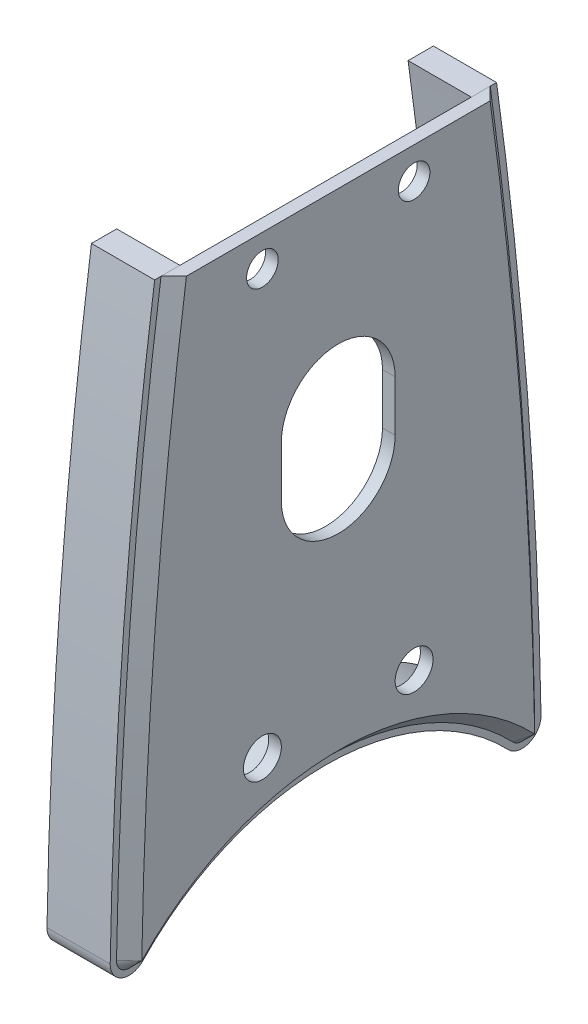
ISO-10303-21;
HEADER;
FILE_DESCRIPTION(('STEP AP214'),'2;1');
FILE_NAME('part.step','',(''),(''),'','','');
FILE_SCHEMA(('AUTOMOTIVE_DESIGN { 1 0 10303 214 1 1 1 1 }'));
ENDSEC;
DATA;
#1=APPLICATION_CONTEXT('core data for automotive mechanical design processes');
#2=APPLICATION_PROTOCOL_DEFINITION('international standard','automotive_design',2000,#1);
#3=PRODUCT_CONTEXT('',#1,'mechanical');
#4=PRODUCT('Part','Part','',(#3));
#5=PRODUCT_RELATED_PRODUCT_CATEGORY('part','',(#4));
#6=PRODUCT_DEFINITION_FORMATION('','',#4);
#7=PRODUCT_DEFINITION_CONTEXT('part definition',#1,'design');
#8=PRODUCT_DEFINITION('design','',#6,#7);
#9=PRODUCT_DEFINITION_SHAPE('','',#8);
#10=(LENGTH_UNIT() NAMED_UNIT(*) SI_UNIT(.MILLI.,.METRE.));
#11=(NAMED_UNIT(*) PLANE_ANGLE_UNIT() SI_UNIT($,.RADIAN.));
#12=(NAMED_UNIT(*) SI_UNIT($,.STERADIAN.) SOLID_ANGLE_UNIT());
#13=UNCERTAINTY_MEASURE_WITH_UNIT(LENGTH_MEASURE(1.E-05),#10,'distance_accuracy_value','');
#14=(GEOMETRIC_REPRESENTATION_CONTEXT(3) GLOBAL_UNCERTAINTY_ASSIGNED_CONTEXT((#13)) GLOBAL_UNIT_ASSIGNED_CONTEXT((#10,
#11,#12)) REPRESENTATION_CONTEXT('',''));
#15=CARTESIAN_POINT('',(0.,0.,0.));
#16=DIRECTION('',(0.,0.,1.));
#17=DIRECTION('',(1.,0.,0.));
#18=AXIS2_PLACEMENT_3D('',#15,#16,#17);
#19=CARTESIAN_POINT('',(-10.,38.5568522504319,26.8769258758952));
#20=DIRECTION('',(1.,0.,0.));
#21=DIRECTION('',(0.,0.,-1.));
#22=AXIS2_PLACEMENT_3D('',#19,#20,#21);
#23=CYLINDRICAL_SURFACE('',#22,3.00000000000001);
#24=CARTESIAN_POINT('',(0.,38.5568522504319,26.8769258758952));
#25=DIRECTION('',(-1.,0.,0.));
#26=DIRECTION('',(0.,0.,1.));
#27=AXIS2_PLACEMENT_3D('',#24,#25,#26);
#28=CIRCLE('',#27,3.00000000000001);
#29=CARTESIAN_POINT('',(0.,36.0957765748724,25.1613774157316));
#30=VERTEX_POINT('',#29);
#31=CARTESIAN_POINT('',(0.,38.6444801711164,29.8756458273939));
#32=VERTEX_POINT('',#31);
#33=EDGE_CURVE('E256',#30,#32,#28,.T.);
#34=ORIENTED_EDGE('',*,*,#33,.F.);
#35=DIRECTION('',(1.,0.,0.));
#36=VECTOR('',#35,1.);
#37=CARTESIAN_POINT('',(-10.,36.0957765748724,25.1613774157316));
#38=LINE('',#37,#36);
#39=CARTESIAN_POINT('',(-10.,36.0957765748724,25.1613774157316));
#40=VERTEX_POINT('',#39);
#41=EDGE_CURVE('E12',#40,#30,#38,.T.);
#42=ORIENTED_EDGE('',*,*,#41,.F.);
#43=CARTESIAN_POINT('',(-10.,38.5568522504319,26.8769258758952));
#44=DIRECTION('',(-1.,0.,0.));
#45=DIRECTION('',(0.,0.,1.));
#46=AXIS2_PLACEMENT_3D('',#43,#44,#45);
#47=CIRCLE('',#46,3.00000000000001);
#48=CARTESIAN_POINT('',(-10.,38.6444801711164,29.8756458273939));
#49=VERTEX_POINT('',#48);
#50=EDGE_CURVE('E200',#40,#49,#47,.T.);
#51=ORIENTED_EDGE('',*,*,#50,.T.);
#52=DIRECTION('',(1.,0.,0.));
#53=VECTOR('',#52,1.);
#54=CARTESIAN_POINT('',(-10.,38.6444801711164,29.8756458273939));
#55=LINE('',#54,#53);
#56=EDGE_CURVE('E74',#49,#32,#55,.T.);
#57=ORIENTED_EDGE('',*,*,#56,.T.);
#58=EDGE_LOOP('',(#34,#42,#51,#57));
#59=FACE_BOUND('',#58,.T.);
#60=ADVANCED_FACE('F57',(#59),#23,.F.);
#61=CARTESIAN_POINT('',(-10.,0.,0.));
#62=DIRECTION('',(1.,0.,0.));
#63=DIRECTION('',(0.,0.,-1.));
#64=AXIS2_PLACEMENT_3D('',#61,#62,#63);
#65=CYLINDRICAL_SURFACE('',#64,44.);
#66=CARTESIAN_POINT('',(0.,0.,0.));
#67=DIRECTION('',(-1.,0.,0.));
#68=DIRECTION('',(0.,0.,1.));
#69=AXIS2_PLACEMENT_3D('',#66,#67,#68);
#70=CIRCLE('',#69,44.);
#71=CARTESIAN_POINT('',(0.,36.0957765748724,-25.1613774157316));
#72=VERTEX_POINT('',#71);
#73=EDGE_CURVE('E253',#30,#72,#70,.T.);
#74=ORIENTED_EDGE('',*,*,#73,.T.);
#75=DIRECTION('',(1.,0.,0.));
#76=VECTOR('',#75,1.);
#77=CARTESIAN_POINT('',(-10.,36.0957765748724,-25.1613774157316));
#78=LINE('',#77,#76);
#79=CARTESIAN_POINT('',(-10.,36.0957765748724,-25.1613774157316));
#80=VERTEX_POINT('',#79);
#81=EDGE_CURVE('E66',#80,#72,#78,.T.);
#82=ORIENTED_EDGE('',*,*,#81,.F.);
#83=CARTESIAN_POINT('',(-10.,0.,0.));
#84=DIRECTION('',(-1.,0.,0.));
#85=DIRECTION('',(0.,0.,1.));
#86=AXIS2_PLACEMENT_3D('',#83,#84,#85);
#87=CIRCLE('',#86,44.);
#88=EDGE_CURVE('E195',#40,#80,#87,.T.);
#89=ORIENTED_EDGE('',*,*,#88,.F.);
#90=ORIENTED_EDGE('',*,*,#41,.T.);
#91=EDGE_LOOP('',(#74,#82,#89,#90));
#92=FACE_BOUND('',#91,.T.);
#93=ADVANCED_FACE('F254',(#92),#65,.T.);
#94=CARTESIAN_POINT('',(-10.,38.5568522504319,-26.8769258758952));
#95=DIRECTION('',(1.,0.,0.));
#96=DIRECTION('',(0.,0.,-1.));
#97=AXIS2_PLACEMENT_3D('',#94,#95,#96);
#98=CYLINDRICAL_SURFACE('',#97,3.00000000000002);
#99=CARTESIAN_POINT('',(0.,38.5568522504319,-26.8769258758952));
#100=DIRECTION('',(-1.,0.,0.));
#101=DIRECTION('',(0.,0.,1.));
#102=AXIS2_PLACEMENT_3D('',#99,#100,#101);
#103=CIRCLE('',#102,3.00000000000002);
#104=CARTESIAN_POINT('',(0.,38.6444801711163,-29.8756458273939));
#105=VERTEX_POINT('',#104);
#106=EDGE_CURVE('E248',#105,#72,#103,.T.);
#107=ORIENTED_EDGE('',*,*,#106,.F.);
#108=DIRECTION('',(1.,0.,0.));
#109=VECTOR('',#108,1.);
#110=CARTESIAN_POINT('',(-10.,38.6444801711163,-29.8756458273939));
#111=LINE('',#110,#109);
#112=CARTESIAN_POINT('',(-10.,38.6444801711163,-29.8756458273939));
#113=VERTEX_POINT('',#112);
#114=EDGE_CURVE('E239',#113,#105,#111,.T.);
#115=ORIENTED_EDGE('',*,*,#114,.F.);
#116=CARTESIAN_POINT('',(-10.,38.5568522504319,-26.8769258758952));
#117=DIRECTION('',(-1.,0.,0.));
#118=DIRECTION('',(0.,0.,1.));
#119=AXIS2_PLACEMENT_3D('',#116,#117,#118);
#120=CIRCLE('',#119,3.00000000000002);
#121=EDGE_CURVE('E191',#113,#80,#120,.T.);
#122=ORIENTED_EDGE('',*,*,#121,.T.);
#123=ORIENTED_EDGE('',*,*,#81,.T.);
#124=EDGE_LOOP('',(#107,#115,#122,#123));
#125=FACE_BOUND('',#124,.T.);
#126=ADVANCED_FACE('F246',(#125),#98,.F.);
#127=CARTESIAN_POINT('',(-10.,16.7375000000002,719.804342047287));
#128=DIRECTION('',(1.,0.,0.));
#129=DIRECTION('',(0.,0.,-1.));
#130=AXIS2_PLACEMENT_3D('',#127,#128,#129);
#131=CYLINDRICAL_SURFACE('',#130,750.);
#132=CARTESIAN_POINT('',(0.,16.7375000000002,719.804342047287));
#133=DIRECTION('',(-1.,0.,0.));
#134=DIRECTION('',(0.,0.,1.));
#135=AXIS2_PLACEMENT_3D('',#132,#133,#134);
#136=CIRCLE('',#135,750.);
#137=CARTESIAN_POINT('',(0.,120.,-23.0528825213036));
#138=VERTEX_POINT('',#137);
#139=EDGE_CURVE('E261',#138,#105,#136,.T.);
#140=ORIENTED_EDGE('',*,*,#139,.F.);
#141=DIRECTION('',(1.,0.,0.));
#142=VECTOR('',#141,1.);
#143=CARTESIAN_POINT('',(-10.,120.,-23.0528825213036));
#144=LINE('',#143,#142);
#145=CARTESIAN_POINT('',(-10.,120.,-23.0528825213036));
#146=VERTEX_POINT('',#145);
#147=EDGE_CURVE('E236',#146,#138,#144,.T.);
#148=ORIENTED_EDGE('',*,*,#147,.F.);
#149=CARTESIAN_POINT('',(-10.,16.7375000000002,719.804342047287));
#150=DIRECTION('',(-1.,0.,0.));
#151=DIRECTION('',(0.,0.,1.));
#152=AXIS2_PLACEMENT_3D('',#149,#150,#151);
#153=CIRCLE('',#152,750.);
#154=EDGE_CURVE('E183',#146,#113,#153,.T.);
#155=ORIENTED_EDGE('',*,*,#154,.T.);
#156=ORIENTED_EDGE('',*,*,#114,.T.);
#157=EDGE_LOOP('',(#140,#148,#155,#156));
#158=FACE_BOUND('',#157,.T.);
#159=ADVANCED_FACE('F300',(#158),#131,.F.);
#160=CARTESIAN_POINT('',(-10.,120.,0.));
#161=DIRECTION('',(0.,-1.,0.));
#162=DIRECTION('',(0.,0.,-1.));
#163=AXIS2_PLACEMENT_3D('',#160,#161,#162);
#164=PLANE('',#163);
#165=DIRECTION('',(0.,0.,-1.));
#166=VECTOR('',#165,1.);
#167=CARTESIAN_POINT('',(0.,120.,0.));
#168=LINE('',#167,#166);
#169=CARTESIAN_POINT('',(0.,120.,-27.0528825213036));
#170=VERTEX_POINT('',#169);
#171=EDGE_CURVE('E210',#138,#170,#168,.T.);
#172=ORIENTED_EDGE('',*,*,#171,.T.);
#173=DIRECTION('',(1.,0.,0.));
#174=VECTOR('',#173,1.);
#175=CARTESIAN_POINT('',(-10.,120.,-27.0528825213036));
#176=LINE('',#175,#174);
#177=CARTESIAN_POINT('',(-10.,120.,-27.0528825213036));
#178=VERTEX_POINT('',#177);
#179=EDGE_CURVE('E232',#178,#170,#176,.T.);
#180=ORIENTED_EDGE('',*,*,#179,.F.);
#181=DIRECTION('',(0.,0.,-1.));
#182=VECTOR('',#181,1.);
#183=CARTESIAN_POINT('',(-10.,120.,0.));
#184=LINE('',#183,#182);
#185=EDGE_CURVE('E176',#146,#178,#184,.T.);
#186=ORIENTED_EDGE('',*,*,#185,.F.);
#187=ORIENTED_EDGE('',*,*,#147,.T.);
#188=EDGE_LOOP('',(#172,#180,#186,#187));
#189=FACE_BOUND('',#188,.T.);
#190=ADVANCED_FACE('F310',(#189),#164,.F.);
#191=CARTESIAN_POINT('',(-10.,16.7375000000002,715.804342047287));
#192=DIRECTION('',(1.,0.,0.));
#193=DIRECTION('',(0.,0.,-1.));
#194=AXIS2_PLACEMENT_3D('',#191,#192,#193);
#195=CYLINDRICAL_SURFACE('',#194,750.);
#196=CARTESIAN_POINT('',(0.,16.7375000000002,715.804342047287));
#197=DIRECTION('',(-1.,0.,0.));
#198=DIRECTION('',(0.,0.,1.));
#199=AXIS2_PLACEMENT_3D('',#196,#197,#198);
#200=CIRCLE('',#199,750.);
#201=CARTESIAN_POINT('',(0.,29.7648946533857,-34.0825074097123));
#202=VERTEX_POINT('',#201);
#203=EDGE_CURVE('E269',#170,#202,#200,.T.);
#204=ORIENTED_EDGE('',*,*,#203,.T.);
#205=DIRECTION('',(1.,0.,0.));
#206=VECTOR('',#205,1.);
#207=CARTESIAN_POINT('',(-10.,29.7648946533857,-34.0825074097123));
#208=LINE('',#207,#206);
#209=CARTESIAN_POINT('',(-10.,29.7648946533857,-34.0825074097123));
#210=VERTEX_POINT('',#209);
#211=EDGE_CURVE('E228',#210,#202,#208,.T.);
#212=ORIENTED_EDGE('',*,*,#211,.F.);
#213=CARTESIAN_POINT('',(-10.,16.7375000000002,715.804342047287));
#214=DIRECTION('',(-1.,0.,0.));
#215=DIRECTION('',(0.,0.,1.));
#216=AXIS2_PLACEMENT_3D('',#213,#214,#215);
#217=CIRCLE('',#216,750.);
#218=EDGE_CURVE('E182',#178,#210,#217,.T.);
#219=ORIENTED_EDGE('',*,*,#218,.F.);
#220=ORIENTED_EDGE('',*,*,#179,.T.);
#221=EDGE_LOOP('',(#204,#212,#219,#220));
#222=FACE_BOUND('',#221,.T.);
#223=ADVANCED_FACE('F298',(#222),#195,.T.);
#224=CARTESIAN_POINT('',(-10.,29.7127850747721,-31.0829600118843));
#225=DIRECTION('',(1.,0.,0.));
#226=DIRECTION('',(0.,0.,-1.));
#227=AXIS2_PLACEMENT_3D('',#224,#225,#226);
#228=CYLINDRICAL_SURFACE('',#227,2.99999999999995);
#229=CARTESIAN_POINT('',(0.,29.7127850747721,-31.0829600118843));
#230=DIRECTION('',(-1.,0.,0.));
#231=DIRECTION('',(0.,0.,1.));
#232=AXIS2_PLACEMENT_3D('',#229,#230,#231);
#233=CIRCLE('',#232,2.99999999999995);
#234=CARTESIAN_POINT('',(0.,27.6398000695554,-28.914381406404));
#235=VERTEX_POINT('',#234);
#236=EDGE_CURVE('E272',#202,#235,#233,.T.);
#237=ORIENTED_EDGE('',*,*,#236,.T.);
#238=DIRECTION('',(1.,0.,0.));
#239=VECTOR('',#238,1.);
#240=CARTESIAN_POINT('',(-10.,27.6398000695554,-28.914381406404));
#241=LINE('',#240,#239);
#242=CARTESIAN_POINT('',(-10.,27.6398000695554,-28.914381406404));
#243=VERTEX_POINT('',#242);
#244=EDGE_CURVE('E224',#243,#235,#241,.T.);
#245=ORIENTED_EDGE('',*,*,#244,.F.);
#246=CARTESIAN_POINT('',(-10.,29.7127850747721,-31.0829600118843));
#247=DIRECTION('',(-1.,0.,0.));
#248=DIRECTION('',(0.,0.,1.));
#249=AXIS2_PLACEMENT_3D('',#246,#247,#248);
#250=CIRCLE('',#249,2.99999999999995);
#251=EDGE_CURVE('E189',#210,#243,#250,.T.);
#252=ORIENTED_EDGE('',*,*,#251,.F.);
#253=ORIENTED_EDGE('',*,*,#211,.T.);
#254=EDGE_LOOP('',(#237,#245,#252,#253));
#255=FACE_BOUND('',#254,.T.);
#256=ADVANCED_FACE('F294',(#255),#228,.T.);
#257=CARTESIAN_POINT('',(-10.,0.,0.));
#258=DIRECTION('',(1.,0.,0.));
#259=DIRECTION('',(0.,0.,-1.));
#260=AXIS2_PLACEMENT_3D('',#257,#258,#259);
#261=CYLINDRICAL_SURFACE('',#260,40.);
#262=CARTESIAN_POINT('',(0.,0.,0.));
#263=DIRECTION('',(-1.,0.,0.));
#264=DIRECTION('',(0.,0.,1.));
#265=AXIS2_PLACEMENT_3D('',#262,#263,#264);
#266=CIRCLE('',#265,40.);
#267=CARTESIAN_POINT('',(0.,27.6398000695555,28.9143814064041));
#268=VERTEX_POINT('',#267);
#269=EDGE_CURVE('E275',#235,#268,#266,.F.);
#270=ORIENTED_EDGE('',*,*,#269,.T.);
#271=DIRECTION('',(1.,0.,0.));
#272=VECTOR('',#271,1.);
#273=CARTESIAN_POINT('',(-10.,27.6398000695555,28.9143814064041));
#274=LINE('',#273,#272);
#275=CARTESIAN_POINT('',(-10.,27.6398000695555,28.9143814064041));
#276=VERTEX_POINT('',#275);
#277=EDGE_CURVE('E220',#276,#268,#274,.T.);
#278=ORIENTED_EDGE('',*,*,#277,.F.);
#279=CARTESIAN_POINT('',(-10.,0.,0.));
#280=DIRECTION('',(-1.,0.,0.));
#281=DIRECTION('',(0.,0.,1.));
#282=AXIS2_PLACEMENT_3D('',#279,#280,#281);
#283=CIRCLE('',#282,40.);
#284=EDGE_CURVE('E291',#243,#276,#283,.F.);
#285=ORIENTED_EDGE('',*,*,#284,.F.);
#286=ORIENTED_EDGE('',*,*,#244,.T.);
#287=EDGE_LOOP('',(#270,#278,#285,#286));
#288=FACE_BOUND('',#287,.T.);
#289=ADVANCED_FACE('F288',(#288),#261,.F.);
#290=CARTESIAN_POINT('',(-10.,29.7127850747721,31.0829600118843));
#291=DIRECTION('',(1.,0.,0.));
#292=DIRECTION('',(0.,0.,-1.));
#293=AXIS2_PLACEMENT_3D('',#290,#291,#292);
#294=CYLINDRICAL_SURFACE('',#293,2.99999999999995);
#295=CARTESIAN_POINT('',(0.,29.7127850747721,31.0829600118843));
#296=DIRECTION('',(-1.,0.,0.));
#297=DIRECTION('',(0.,0.,1.));
#298=AXIS2_PLACEMENT_3D('',#295,#296,#297);
#299=CIRCLE('',#298,2.99999999999995);
#300=CARTESIAN_POINT('',(0.,29.7648946533857,34.0825074097123));
#301=VERTEX_POINT('',#300);
#302=EDGE_CURVE('E277',#268,#301,#299,.T.);
#303=ORIENTED_EDGE('',*,*,#302,.T.);
#304=DIRECTION('',(1.,0.,0.));
#305=VECTOR('',#304,1.);
#306=CARTESIAN_POINT('',(-10.,29.7648946533857,34.0825074097123));
#307=LINE('',#306,#305);
#308=CARTESIAN_POINT('',(-10.,29.7648946533857,34.0825074097123));
#309=VERTEX_POINT('',#308);
#310=EDGE_CURVE('E170',#309,#301,#307,.T.);
#311=ORIENTED_EDGE('',*,*,#310,.F.);
#312=CARTESIAN_POINT('',(-10.,29.7127850747721,31.0829600118843));
#313=DIRECTION('',(-1.,0.,0.));
#314=DIRECTION('',(0.,0.,1.));
#315=AXIS2_PLACEMENT_3D('',#312,#313,#314);
#316=CIRCLE('',#315,2.99999999999995);
#317=EDGE_CURVE('E156',#276,#309,#316,.T.);
#318=ORIENTED_EDGE('',*,*,#317,.F.);
#319=ORIENTED_EDGE('',*,*,#277,.T.);
#320=EDGE_LOOP('',(#303,#311,#318,#319));
#321=FACE_BOUND('',#320,.T.);
#322=ADVANCED_FACE('F282',(#321),#294,.T.);
#323=CARTESIAN_POINT('',(-10.,16.7375000000002,-715.804342047287));
#324=DIRECTION('',(1.,0.,0.));
#325=DIRECTION('',(0.,0.,-1.));
#326=AXIS2_PLACEMENT_3D('',#323,#324,#325);
#327=CYLINDRICAL_SURFACE('',#326,750.);
#328=CARTESIAN_POINT('',(0.,16.7375000000002,-715.804342047287));
#329=DIRECTION('',(-1.,0.,0.));
#330=DIRECTION('',(0.,0.,1.));
#331=AXIS2_PLACEMENT_3D('',#328,#329,#330);
#332=CIRCLE('',#331,750.);
#333=CARTESIAN_POINT('',(0.,120.,27.0528825213036));
#334=VERTEX_POINT('',#333);
#335=EDGE_CURVE('E166',#301,#334,#332,.T.);
#336=ORIENTED_EDGE('',*,*,#335,.T.);
#337=DIRECTION('',(1.,0.,0.));
#338=VECTOR('',#337,1.);
#339=CARTESIAN_POINT('',(-10.,120.,27.0528825213036));
#340=LINE('',#339,#338);
#341=CARTESIAN_POINT('',(-10.,120.,27.0528825213036));
#342=VERTEX_POINT('',#341);
#343=EDGE_CURVE('E163',#342,#334,#340,.T.);
#344=ORIENTED_EDGE('',*,*,#343,.F.);
#345=CARTESIAN_POINT('',(-10.,16.7375000000002,-715.804342047287));
#346=DIRECTION('',(-1.,0.,0.));
#347=DIRECTION('',(0.,0.,1.));
#348=AXIS2_PLACEMENT_3D('',#345,#346,#347);
#349=CIRCLE('',#348,750.);
#350=EDGE_CURVE('E148',#309,#342,#349,.T.);
#351=ORIENTED_EDGE('',*,*,#350,.F.);
#352=ORIENTED_EDGE('',*,*,#310,.T.);
#353=EDGE_LOOP('',(#336,#344,#351,#352));
#354=FACE_BOUND('',#353,.T.);
#355=ADVANCED_FACE('F164',(#354),#327,.T.);
#356=CARTESIAN_POINT('',(0.,120.,23.0528825213036));
#357=VERTEX_POINT('',#356);
#358=EDGE_CURVE('E205',#334,#357,#168,.T.);
#359=ORIENTED_EDGE('',*,*,#358,.T.);
#360=DIRECTION('',(1.,0.,0.));
#361=VECTOR('',#360,1.);
#362=CARTESIAN_POINT('',(-10.,120.,23.0528825213036));
#363=LINE('',#362,#361);
#364=CARTESIAN_POINT('',(-10.,120.,23.0528825213036));
#365=VERTEX_POINT('',#364);
#366=EDGE_CURVE('E112',#365,#357,#363,.T.);
#367=ORIENTED_EDGE('',*,*,#366,.F.);
#368=EDGE_CURVE('E154',#342,#365,#184,.T.);
#369=ORIENTED_EDGE('',*,*,#368,.F.);
#370=ORIENTED_EDGE('',*,*,#343,.T.);
#371=EDGE_LOOP('',(#359,#367,#369,#370));
#372=FACE_BOUND('',#371,.T.);
#373=ADVANCED_FACE('F172',(#372),#164,.F.);
#374=CARTESIAN_POINT('',(-10.,16.7375000000002,-719.804342047287));
#375=DIRECTION('',(1.,0.,0.));
#376=DIRECTION('',(0.,0.,-1.));
#377=AXIS2_PLACEMENT_3D('',#374,#375,#376);
#378=CYLINDRICAL_SURFACE('',#377,750.);
#379=CARTESIAN_POINT('',(0.,16.7375000000002,-719.804342047287));
#380=DIRECTION('',(-1.,0.,0.));
#381=DIRECTION('',(0.,0.,1.));
#382=AXIS2_PLACEMENT_3D('',#379,#380,#381);
#383=CIRCLE('',#382,750.);
#384=EDGE_CURVE('E202',#32,#357,#383,.T.);
#385=ORIENTED_EDGE('',*,*,#384,.F.);
#386=ORIENTED_EDGE('',*,*,#56,.F.);
#387=CARTESIAN_POINT('',(-10.,16.7375000000002,-719.804342047287));
#388=DIRECTION('',(-1.,0.,0.));
#389=DIRECTION('',(0.,0.,1.));
#390=AXIS2_PLACEMENT_3D('',#387,#388,#389);
#391=CIRCLE('',#390,750.);
#392=EDGE_CURVE('E174',#49,#365,#391,.T.);
#393=ORIENTED_EDGE('',*,*,#392,.T.);
#394=ORIENTED_EDGE('',*,*,#366,.T.);
#395=EDGE_LOOP('',(#385,#386,#393,#394));
#396=FACE_BOUND('',#395,.T.);
#397=ADVANCED_FACE('F301',(#396),#378,.F.);
#398=CARTESIAN_POINT('',(-10.,0.,0.));
#399=DIRECTION('',(-1.,0.,0.));
#400=DIRECTION('',(0.,0.,1.));
#401=AXIS2_PLACEMENT_3D('',#398,#399,#400);
#402=PLANE('',#401);
#403=ORIENTED_EDGE('',*,*,#50,.F.);
#404=ORIENTED_EDGE('',*,*,#88,.T.);
#405=ORIENTED_EDGE('',*,*,#121,.F.);
#406=ORIENTED_EDGE('',*,*,#154,.F.);
#407=ORIENTED_EDGE('',*,*,#185,.T.);
#408=ORIENTED_EDGE('',*,*,#218,.T.);
#409=ORIENTED_EDGE('',*,*,#251,.T.);
#410=ORIENTED_EDGE('',*,*,#284,.T.);
#411=ORIENTED_EDGE('',*,*,#317,.T.);
#412=ORIENTED_EDGE('',*,*,#350,.T.);
#413=ORIENTED_EDGE('',*,*,#368,.T.);
#414=ORIENTED_EDGE('',*,*,#392,.F.);
#415=EDGE_LOOP('',(#403,#404,#405,#406,#407,#408,#409,#410,#411,#412,#413,#414));
#416=FACE_BOUND('',#415,.T.);
#417=ADVANCED_FACE('F151',(#416),#402,.T.);
#418=CARTESIAN_POINT('',(0.,0.,0.));
#419=DIRECTION('',(-1.,0.,0.));
#420=DIRECTION('',(0.,0.,1.));
#421=AXIS2_PLACEMENT_3D('',#418,#419,#420);
#422=PLANE('',#421);
#423=ORIENTED_EDGE('',*,*,#33,.T.);
#424=ORIENTED_EDGE('',*,*,#384,.T.);
#425=ORIENTED_EDGE('',*,*,#358,.F.);
#426=ORIENTED_EDGE('',*,*,#335,.F.);
#427=ORIENTED_EDGE('',*,*,#302,.F.);
#428=ORIENTED_EDGE('',*,*,#269,.F.);
#429=ORIENTED_EDGE('',*,*,#236,.F.);
#430=ORIENTED_EDGE('',*,*,#203,.F.);
#431=ORIENTED_EDGE('',*,*,#171,.F.);
#432=ORIENTED_EDGE('',*,*,#139,.T.);
#433=ORIENTED_EDGE('',*,*,#106,.T.);
#434=ORIENTED_EDGE('',*,*,#73,.F.);
#435=EDGE_LOOP('',(#423,#424,#425,#426,#427,#428,#429,#430,#431,#432,#433,#434));
#436=FACE_BOUND('',#435,.T.);
#437=ADVANCED_FACE('F258',(#436),#422,.F.);
#438=CLOSED_SHELL('',(#60,#93,#126,#159,#190,#223,#256,#289,#322,#355,#373,#397,#417,#437));
#439=MANIFOLD_SOLID_BREP('B2',#438);
#440=CARTESIAN_POINT('',(2.,16.7375000000002,-715.804342047287));
#441=DIRECTION('',(-1.,0.,0.));
#442=DIRECTION('',(0.,0.,1.));
#443=AXIS2_PLACEMENT_3D('',#440,#441,#442);
#444=PLANE('',#443);
#445=CARTESIAN_POINT('',(2.,48.,12.));
#446=DIRECTION('',(1.,0.,0.));
#447=DIRECTION('',(0.,0.,-1.));
#448=AXIS2_PLACEMENT_3D('',#445,#446,#447);
#449=CIRCLE('',#448,3.);
#450=CARTESIAN_POINT('',(2.,48.,9.));
#451=VERTEX_POINT('',#450);
#452=EDGE_CURVE('E616',#451,#451,#449,.T.);
#453=ORIENTED_EDGE('',*,*,#452,.F.);
#454=EDGE_LOOP('',(#453));
#455=FACE_BOUND('',#454,.T.);
#456=CARTESIAN_POINT('',(2.,48.,-12.));
#457=DIRECTION('',(1.,0.,0.));
#458=DIRECTION('',(0.,0.,-1.));
#459=AXIS2_PLACEMENT_3D('',#456,#457,#458);
#460=CIRCLE('',#459,3.);
#461=CARTESIAN_POINT('',(2.,48.,-15.));
#462=VERTEX_POINT('',#461);
#463=EDGE_CURVE('E578',#462,#462,#460,.T.);
#464=ORIENTED_EDGE('',*,*,#463,.F.);
#465=EDGE_LOOP('',(#464));
#466=FACE_BOUND('',#465,.T.);
#467=DIRECTION('',(0.,1.,0.));
#468=VECTOR('',#467,1.);
#469=CARTESIAN_POINT('',(2.,89.7,9.));
#470=LINE('',#469,#468);
#471=CARTESIAN_POINT('',(2.,81.7,9.00000000000001));
#472=VERTEX_POINT('',#471);
#473=CARTESIAN_POINT('',(2.,89.7,9.));
#474=VERTEX_POINT('',#473);
#475=EDGE_CURVE('E560',#472,#474,#470,.T.);
#476=ORIENTED_EDGE('',*,*,#475,.T.);
#477=CARTESIAN_POINT('',(2.,89.7,0.));
#478=DIRECTION('',(-1.,0.,0.));
#479=DIRECTION('',(0.,0.,1.));
#480=AXIS2_PLACEMENT_3D('',#477,#478,#479);
#481=CIRCLE('',#480,9.);
#482=CARTESIAN_POINT('',(2.,89.7,-9.));
#483=VERTEX_POINT('',#482);
#484=EDGE_CURVE('E552',#474,#483,#481,.T.);
#485=ORIENTED_EDGE('',*,*,#484,.T.);
#486=DIRECTION('',(0.,-1.,0.));
#487=VECTOR('',#486,1.);
#488=CARTESIAN_POINT('',(2.,89.7,-9.));
#489=LINE('',#488,#487);
#490=CARTESIAN_POINT('',(2.,81.7,-9.00000000000002));
#491=VERTEX_POINT('',#490);
#492=EDGE_CURVE('E564',#483,#491,#489,.T.);
#493=ORIENTED_EDGE('',*,*,#492,.T.);
#494=CARTESIAN_POINT('',(2.,81.7,0.));
#495=DIRECTION('',(-1.,0.,0.));
#496=DIRECTION('',(0.,0.,1.));
#497=AXIS2_PLACEMENT_3D('',#494,#495,#496);
#498=CIRCLE('',#497,9.);
#499=EDGE_CURVE('E568',#491,#472,#498,.T.);
#500=ORIENTED_EDGE('',*,*,#499,.T.);
#501=EDGE_LOOP('',(#476,#485,#493,#500));
#502=FACE_BOUND('',#501,.T.);
#503=CARTESIAN_POINT('',(2.,0.,0.));
#504=DIRECTION('',(-1.,0.,0.));
#505=DIRECTION('',(0.,0.,1.));
#506=AXIS2_PLACEMENT_3D('',#503,#504,#505);
#507=CIRCLE('',#506,43.0000000000001);
#508=CARTESIAN_POINT('',(2.,29.7127850747721,31.0829600118845));
#509=VERTEX_POINT('',#508);
#510=CARTESIAN_POINT('',(2.,29.7127850747721,-31.0829600118844));
#511=VERTEX_POINT('',#510);
#512=EDGE_CURVE('E620',#509,#511,#507,.T.);
#513=ORIENTED_EDGE('',*,*,#512,.T.);
#514=CARTESIAN_POINT('',(2.,16.7375000000002,715.804342047287));
#515=DIRECTION('',(-1.,0.,0.));
#516=DIRECTION('',(0.,0.,1.));
#517=AXIS2_PLACEMENT_3D('',#514,#515,#516);
#518=CIRCLE('',#517,747.);
#519=CARTESIAN_POINT('',(2.,120.,-24.0239191686179));
#520=VERTEX_POINT('',#519);
#521=EDGE_CURVE('E622',#511,#520,#518,.F.);
#522=ORIENTED_EDGE('',*,*,#521,.T.);
#523=DIRECTION('',(0.,0.,1.));
#524=VECTOR('',#523,1.);
#525=CARTESIAN_POINT('',(2.,120.,27.0528825213036));
#526=LINE('',#525,#524);
#527=CARTESIAN_POINT('',(2.,120.,24.0239191686181));
#528=VERTEX_POINT('',#527);
#529=EDGE_CURVE('E607',#520,#528,#526,.T.);
#530=ORIENTED_EDGE('',*,*,#529,.T.);
#531=CARTESIAN_POINT('',(2.,16.7375000000002,-715.804342047287));
#532=DIRECTION('',(-1.,0.,0.));
#533=DIRECTION('',(0.,0.,1.));
#534=AXIS2_PLACEMENT_3D('',#531,#532,#533);
#535=CIRCLE('',#534,747.);
#536=EDGE_CURVE('E610',#528,#509,#535,.F.);
#537=ORIENTED_EDGE('',*,*,#536,.T.);
#538=EDGE_LOOP('',(#513,#522,#530,#537));
#539=FACE_BOUND('',#538,.T.);
#540=CARTESIAN_POINT('',(2.,115.,12.));
#541=DIRECTION('',(1.,0.,0.));
#542=DIRECTION('',(0.,0.,-1.));
#543=AXIS2_PLACEMENT_3D('',#540,#541,#542);
#544=CIRCLE('',#543,2.5);
#545=CARTESIAN_POINT('',(2.,115.,9.50000000000001));
#546=VERTEX_POINT('',#545);
#547=EDGE_CURVE('E601',#546,#546,#544,.T.);
#548=ORIENTED_EDGE('',*,*,#547,.F.);
#549=EDGE_LOOP('',(#548));
#550=FACE_BOUND('',#549,.T.);
#551=CARTESIAN_POINT('',(2.,115.,-12.));
#552=DIRECTION('',(1.,0.,0.));
#553=DIRECTION('',(0.,0.,-1.));
#554=AXIS2_PLACEMENT_3D('',#551,#552,#553);
#555=CIRCLE('',#554,2.5);
#556=CARTESIAN_POINT('',(2.,115.,-14.5));
#557=VERTEX_POINT('',#556);
#558=EDGE_CURVE('E595',#557,#557,#555,.T.);
#559=ORIENTED_EDGE('',*,*,#558,.F.);
#560=EDGE_LOOP('',(#559));
#561=FACE_BOUND('',#560,.T.);
#562=ADVANCED_FACE('F477',(#455,#466,#502,#539,#550,#561),#444,.F.);
#563=CARTESIAN_POINT('',(0.,16.7375000000002,-715.804342047287));
#564=DIRECTION('',(-1.,0.,0.));
#565=DIRECTION('',(0.,0.,1.));
#566=AXIS2_PLACEMENT_3D('',#563,#564,#565);
#567=PLANE('',#566);
#568=CARTESIAN_POINT('',(0.,48.,12.));
#569=DIRECTION('',(-1.,0.,0.));
#570=DIRECTION('',(0.,0.,1.));
#571=AXIS2_PLACEMENT_3D('',#568,#569,#570);
#572=CIRCLE('',#571,3.);
#573=CARTESIAN_POINT('',(0.,48.,15.));
#574=VERTEX_POINT('',#573);
#575=EDGE_CURVE('E585',#574,#574,#572,.T.);
#576=ORIENTED_EDGE('',*,*,#575,.F.);
#577=EDGE_LOOP('',(#576));
#578=FACE_BOUND('',#577,.T.);
#579=CARTESIAN_POINT('',(0.,48.,-12.));
#580=DIRECTION('',(-1.,0.,0.));
#581=DIRECTION('',(0.,0.,1.));
#582=AXIS2_PLACEMENT_3D('',#579,#580,#581);
#583=CIRCLE('',#582,3.);
#584=CARTESIAN_POINT('',(0.,48.,-9.));
#585=VERTEX_POINT('',#584);
#586=EDGE_CURVE('E613',#585,#585,#583,.T.);
#587=ORIENTED_EDGE('',*,*,#586,.F.);
#588=EDGE_LOOP('',(#587));
#589=FACE_BOUND('',#588,.T.);
#590=CARTESIAN_POINT('',(0.,89.7,0.));
#591=DIRECTION('',(-1.,0.,0.));
#592=DIRECTION('',(0.,0.,1.));
#593=AXIS2_PLACEMENT_3D('',#590,#591,#592);
#594=CIRCLE('',#593,9.);
#595=CARTESIAN_POINT('',(0.,89.7,9.));
#596=VERTEX_POINT('',#595);
#597=CARTESIAN_POINT('',(0.,89.7,-9.00000000000002));
#598=VERTEX_POINT('',#597);
#599=EDGE_CURVE('E555',#596,#598,#594,.T.);
#600=ORIENTED_EDGE('',*,*,#599,.F.);
#601=DIRECTION('',(0.,1.,0.));
#602=VECTOR('',#601,1.);
#603=CARTESIAN_POINT('',(0.,89.7,9.));
#604=LINE('',#603,#602);
#605=CARTESIAN_POINT('',(0.,81.7,9.00000000000001));
#606=VERTEX_POINT('',#605);
#607=EDGE_CURVE('E572',#606,#596,#604,.T.);
#608=ORIENTED_EDGE('',*,*,#607,.F.);
#609=CARTESIAN_POINT('',(0.,81.7,0.));
#610=DIRECTION('',(-1.,0.,0.));
#611=DIRECTION('',(0.,0.,1.));
#612=AXIS2_PLACEMENT_3D('',#609,#610,#611);
#613=CIRCLE('',#612,9.);
#614=CARTESIAN_POINT('',(0.,81.7,-9.));
#615=VERTEX_POINT('',#614);
#616=EDGE_CURVE('E575',#615,#606,#613,.T.);
#617=ORIENTED_EDGE('',*,*,#616,.F.);
#618=DIRECTION('',(0.,-1.,0.));
#619=VECTOR('',#618,1.);
#620=CARTESIAN_POINT('',(0.,89.7,-9.));
#621=LINE('',#620,#619);
#622=EDGE_CURVE('E584',#598,#615,#621,.T.);
#623=ORIENTED_EDGE('',*,*,#622,.F.);
#624=EDGE_LOOP('',(#600,#608,#617,#623));
#625=FACE_BOUND('',#624,.T.);
#626=CARTESIAN_POINT('',(0.,115.,12.));
#627=DIRECTION('',(1.,0.,0.));
#628=DIRECTION('',(0.,0.,-1.));
#629=AXIS2_PLACEMENT_3D('',#626,#627,#628);
#630=CIRCLE('',#629,2.5);
#631=CARTESIAN_POINT('',(0.,115.,9.50000000000001));
#632=VERTEX_POINT('',#631);
#633=EDGE_CURVE('E598',#632,#632,#630,.T.);
#634=ORIENTED_EDGE('',*,*,#633,.T.);
#635=EDGE_LOOP('',(#634));
#636=FACE_BOUND('',#635,.T.);
#637=DIRECTION('',(0.,0.,1.));
#638=VECTOR('',#637,1.);
#639=CARTESIAN_POINT('',(0.,120.,27.0528825213036));
#640=LINE('',#639,#638);
#641=CARTESIAN_POINT('',(0.,120.,-26.0432542241774));
#642=VERTEX_POINT('',#641);
#643=CARTESIAN_POINT('',(0.,120.,26.0432542241773));
#644=VERTEX_POINT('',#643);
#645=EDGE_CURVE('E604',#642,#644,#640,.T.);
#646=ORIENTED_EDGE('',*,*,#645,.F.);
#647=CARTESIAN_POINT('',(0.,16.7375000000002,715.804342047287));
#648=DIRECTION('',(-1.,0.,0.));
#649=DIRECTION('',(0.,0.,1.));
#650=AXIS2_PLACEMENT_3D('',#647,#648,#649);
#651=CIRCLE('',#650,749.);
#652=CARTESIAN_POINT('',(0.,29.7475247938478,-33.082658277103));
#653=VERTEX_POINT('',#652);
#654=EDGE_CURVE('E55',#642,#653,#651,.T.);
#655=ORIENTED_EDGE('',*,*,#654,.T.);
#656=CARTESIAN_POINT('',(0.,29.7127850747721,-31.0829600118843));
#657=DIRECTION('',(-1.,0.,0.));
#658=DIRECTION('',(0.,0.,1.));
#659=AXIS2_PLACEMENT_3D('',#656,#657,#658);
#660=CIRCLE('',#659,2.00000000000002);
#661=CARTESIAN_POINT('',(0.,28.3307950712944,-29.6372409415642));
#662=VERTEX_POINT('',#661);
#663=EDGE_CURVE('E488',#653,#662,#660,.T.);
#664=ORIENTED_EDGE('',*,*,#663,.T.);
#665=CARTESIAN_POINT('',(0.,0.,0.));
#666=DIRECTION('',(-1.,0.,0.));
#667=DIRECTION('',(0.,0.,1.));
#668=AXIS2_PLACEMENT_3D('',#665,#666,#667);
#669=CIRCLE('',#668,41.);
#670=CARTESIAN_POINT('',(0.,28.3307950712943,29.6372409415641));
#671=VERTEX_POINT('',#670);
#672=EDGE_CURVE('E737',#662,#671,#669,.F.);
#673=ORIENTED_EDGE('',*,*,#672,.T.);
#674=CARTESIAN_POINT('',(0.,29.7127850747721,31.0829600118843));
#675=DIRECTION('',(-1.,0.,0.));
#676=DIRECTION('',(0.,0.,1.));
#677=AXIS2_PLACEMENT_3D('',#674,#675,#676);
#678=CIRCLE('',#677,2.00000000000002);
#679=CARTESIAN_POINT('',(0.,29.7475247938478,33.082658277103));
#680=VERTEX_POINT('',#679);
#681=EDGE_CURVE('E739',#671,#680,#678,.T.);
#682=ORIENTED_EDGE('',*,*,#681,.T.);
#683=CARTESIAN_POINT('',(0.,16.7375000000002,-715.804342047287));
#684=DIRECTION('',(-1.,0.,0.));
#685=DIRECTION('',(0.,0.,1.));
#686=AXIS2_PLACEMENT_3D('',#683,#684,#685);
#687=CIRCLE('',#686,749.);
#688=EDGE_CURVE('E740',#680,#644,#687,.T.);
#689=ORIENTED_EDGE('',*,*,#688,.T.);
#690=EDGE_LOOP('',(#646,#655,#664,#673,#682,#689));
#691=FACE_BOUND('',#690,.T.);
#692=CARTESIAN_POINT('',(0.,115.,-12.));
#693=DIRECTION('',(1.,0.,0.));
#694=DIRECTION('',(0.,0.,-1.));
#695=AXIS2_PLACEMENT_3D('',#692,#693,#694);
#696=CIRCLE('',#695,2.5);
#697=CARTESIAN_POINT('',(0.,115.,-14.5));
#698=VERTEX_POINT('',#697);
#699=EDGE_CURVE('E591',#698,#698,#696,.T.);
#700=ORIENTED_EDGE('',*,*,#699,.T.);
#701=EDGE_LOOP('',(#700));
#702=FACE_BOUND('',#701,.T.);
#703=ADVANCED_FACE('F644',(#578,#589,#625,#636,#691,#702),#567,.T.);
#704=CARTESIAN_POINT('',(2.,120.,27.0528825213036));
#705=DIRECTION('',(0.,-1.,0.));
#706=DIRECTION('',(0.,0.,-1.));
#707=AXIS2_PLACEMENT_3D('',#704,#705,#706);
#708=PLANE('',#707);
#709=ORIENTED_EDGE('',*,*,#529,.F.);
#710=CARTESIAN_POINT('',(2.,120.,-24.0239191686179));
#711=CARTESIAN_POINT('',(1.66667103730717,120.,-24.360479340003));
#712=CARTESIAN_POINT('',(1.33333988929408,120.,-24.6970373469921));
#713=CARTESIAN_POINT('',(0.666673222627407,120.,-25.3701490321785));
#714=CARTESIAN_POINT('',(0.333337703973821,120.,-25.7067027103758));
#715=CARTESIAN_POINT('',(0.,120.,-26.0432542241772));
#716=B_SPLINE_CURVE_WITH_KNOTS('',3,(#710,#711,#712,#713,#714,#715),.UNSPECIFIED.,.F.,.F.,(4,2,
4),(0.,1.42106597902351,2.84213195804685),.UNSPECIFIED.);
#717=EDGE_CURVE('E632',#520,#642,#716,.T.);
#718=ORIENTED_EDGE('',*,*,#717,.T.);
#719=ORIENTED_EDGE('',*,*,#645,.T.);
#720=CARTESIAN_POINT('',(0.,120.,26.0432542241773));
#721=CARTESIAN_POINT('',(0.333337703973805,120.,25.7067027103759));
#722=CARTESIAN_POINT('',(0.666673222627361,120.,25.3701490321786));
#723=CARTESIAN_POINT('',(1.33333988929401,120.,24.6970373469922));
#724=CARTESIAN_POINT('',(1.66667103730711,120.,24.3604793400031));
#725=CARTESIAN_POINT('',(1.99999999999996,120.,24.0239191686181));
#726=B_SPLINE_CURVE_WITH_KNOTS('',3,(#720,#721,#722,#723,#724,#725),.UNSPECIFIED.,.F.,.F.,(4,2,
4),(0.,1.4210659790233,2.84213195804677),.UNSPECIFIED.);
#727=EDGE_CURVE('E625',#644,#528,#726,.T.);
#728=ORIENTED_EDGE('',*,*,#727,.T.);
#729=EDGE_LOOP('',(#709,#718,#719,#728));
#730=FACE_BOUND('',#729,.T.);
#731=ADVANCED_FACE('F639',(#730),#708,.F.);
#732=CARTESIAN_POINT('',(2.,115.,12.));
#733=DIRECTION('',(-1.,0.,0.));
#734=DIRECTION('',(0.,0.,1.));
#735=AXIS2_PLACEMENT_3D('',#732,#733,#734);
#736=CYLINDRICAL_SURFACE('',#735,2.5);
#737=ORIENTED_EDGE('',*,*,#547,.T.);
#738=EDGE_LOOP('',(#737));
#739=FACE_BOUND('',#738,.T.);
#740=ORIENTED_EDGE('',*,*,#633,.F.);
#741=EDGE_LOOP('',(#740));
#742=FACE_BOUND('',#741,.T.);
#743=ADVANCED_FACE('F643',(#739,#742),#736,.F.);
#744=CARTESIAN_POINT('',(2.,115.,-12.));
#745=DIRECTION('',(-1.,0.,0.));
#746=DIRECTION('',(0.,0.,1.));
#747=AXIS2_PLACEMENT_3D('',#744,#745,#746);
#748=CYLINDRICAL_SURFACE('',#747,2.5);
#749=ORIENTED_EDGE('',*,*,#558,.T.);
#750=EDGE_LOOP('',(#749));
#751=FACE_BOUND('',#750,.T.);
#752=ORIENTED_EDGE('',*,*,#699,.F.);
#753=EDGE_LOOP('',(#752));
#754=FACE_BOUND('',#753,.T.);
#755=ADVANCED_FACE('F692',(#751,#754),#748,.F.);
#756=CARTESIAN_POINT('',(2.,89.7,0.));
#757=DIRECTION('',(-1.,0.,0.));
#758=DIRECTION('',(0.,0.,1.));
#759=AXIS2_PLACEMENT_3D('',#756,#757,#758);
#760=CYLINDRICAL_SURFACE('',#759,9.);
#761=ORIENTED_EDGE('',*,*,#599,.T.);
#762=DIRECTION('',(-1.,0.,0.));
#763=VECTOR('',#762,1.);
#764=CARTESIAN_POINT('',(2.,89.7,-9.));
#765=LINE('',#764,#763);
#766=EDGE_CURVE('E548',#483,#598,#765,.T.);
#767=ORIENTED_EDGE('',*,*,#766,.F.);
#768=ORIENTED_EDGE('',*,*,#484,.F.);
#769=DIRECTION('',(-1.,0.,0.));
#770=VECTOR('',#769,1.);
#771=CARTESIAN_POINT('',(2.,89.7,9.));
#772=LINE('',#771,#770);
#773=EDGE_CURVE('E589',#474,#596,#772,.T.);
#774=ORIENTED_EDGE('',*,*,#773,.T.);
#775=EDGE_LOOP('',(#761,#767,#768,#774));
#776=FACE_BOUND('',#775,.T.);
#777=ADVANCED_FACE('F550',(#776),#760,.F.);
#778=CARTESIAN_POINT('',(2.,89.7,9.));
#779=DIRECTION('',(0.,0.,1.));
#780=DIRECTION('',(0.,-1.,0.));
#781=AXIS2_PLACEMENT_3D('',#778,#779,#780);
#782=PLANE('',#781);
#783=ORIENTED_EDGE('',*,*,#607,.T.);
#784=ORIENTED_EDGE('',*,*,#773,.F.);
#785=ORIENTED_EDGE('',*,*,#475,.F.);
#786=DIRECTION('',(-1.,0.,0.));
#787=VECTOR('',#786,1.);
#788=CARTESIAN_POINT('',(2.,81.7,9.00000000000001));
#789=LINE('',#788,#787);
#790=EDGE_CURVE('E592',#472,#606,#789,.T.);
#791=ORIENTED_EDGE('',*,*,#790,.T.);
#792=EDGE_LOOP('',(#783,#784,#785,#791));
#793=FACE_BOUND('',#792,.T.);
#794=ADVANCED_FACE('F699',(#793),#782,.F.);
#795=CARTESIAN_POINT('',(2.,81.7,0.));
#796=DIRECTION('',(-1.,0.,0.));
#797=DIRECTION('',(0.,0.,1.));
#798=AXIS2_PLACEMENT_3D('',#795,#796,#797);
#799=CYLINDRICAL_SURFACE('',#798,9.);
#800=ORIENTED_EDGE('',*,*,#616,.T.);
#801=ORIENTED_EDGE('',*,*,#790,.F.);
#802=ORIENTED_EDGE('',*,*,#499,.F.);
#803=DIRECTION('',(-1.,0.,0.));
#804=VECTOR('',#803,1.);
#805=CARTESIAN_POINT('',(2.,81.7,-9.));
#806=LINE('',#805,#804);
#807=EDGE_CURVE('E559',#491,#615,#806,.T.);
#808=ORIENTED_EDGE('',*,*,#807,.T.);
#809=EDGE_LOOP('',(#800,#801,#802,#808));
#810=FACE_BOUND('',#809,.T.);
#811=ADVANCED_FACE('F703',(#810),#799,.F.);
#812=CARTESIAN_POINT('',(2.,89.7,-9.));
#813=DIRECTION('',(0.,0.,-1.));
#814=DIRECTION('',(0.,1.,0.));
#815=AXIS2_PLACEMENT_3D('',#812,#813,#814);
#816=PLANE('',#815);
#817=ORIENTED_EDGE('',*,*,#622,.T.);
#818=ORIENTED_EDGE('',*,*,#807,.F.);
#819=ORIENTED_EDGE('',*,*,#492,.F.);
#820=ORIENTED_EDGE('',*,*,#766,.T.);
#821=EDGE_LOOP('',(#817,#818,#819,#820));
#822=FACE_BOUND('',#821,.T.);
#823=ADVANCED_FACE('F565',(#822),#816,.F.);
#824=CARTESIAN_POINT('',(-8.,48.,-12.));
#825=DIRECTION('',(1.,0.,0.));
#826=DIRECTION('',(0.,0.,-1.));
#827=AXIS2_PLACEMENT_3D('',#824,#825,#826);
#828=CYLINDRICAL_SURFACE('',#827,3.);
#829=ORIENTED_EDGE('',*,*,#586,.T.);
#830=EDGE_LOOP('',(#829));
#831=FACE_BOUND('',#830,.T.);
#832=ORIENTED_EDGE('',*,*,#463,.T.);
#833=EDGE_LOOP('',(#832));
#834=FACE_BOUND('',#833,.T.);
#835=ADVANCED_FACE('F702',(#831,#834),#828,.F.);
#836=CARTESIAN_POINT('',(-8.,48.,12.));
#837=DIRECTION('',(1.,0.,0.));
#838=DIRECTION('',(0.,0.,-1.));
#839=AXIS2_PLACEMENT_3D('',#836,#837,#838);
#840=CYLINDRICAL_SURFACE('',#839,3.);
#841=ORIENTED_EDGE('',*,*,#575,.T.);
#842=EDGE_LOOP('',(#841));
#843=FACE_BOUND('',#842,.T.);
#844=ORIENTED_EDGE('',*,*,#452,.T.);
#845=EDGE_LOOP('',(#844));
#846=FACE_BOUND('',#845,.T.);
#847=ADVANCED_FACE('F678',(#843,#846),#840,.F.);
#848=CARTESIAN_POINT('',(2.,16.7375000000002,-715.804342047287));
#849=DIRECTION('',(-1.,0.,0.));
#850=DIRECTION('',(0.,0.,1.));
#851=AXIS2_PLACEMENT_3D('',#848,#849,#850);
#852=CONICAL_SURFACE('',#851,747.,0.785398163397445);
#853=ORIENTED_EDGE('',*,*,#727,.F.);
#854=ORIENTED_EDGE('',*,*,#688,.F.);
#855=DIRECTION('',(-0.70710678118657,0.0122823454674697,0.707000101831524));
#856=VECTOR('',#855,1.);
#857=CARTESIAN_POINT('',(2.,29.7127850747721,31.0829600118845));
#858=LINE('',#857,#856);
#859=EDGE_CURVE('E483',#509,#680,#858,.T.);
#860=ORIENTED_EDGE('',*,*,#859,.F.);
#861=ORIENTED_EDGE('',*,*,#536,.F.);
#862=EDGE_LOOP('',(#853,#854,#860,#861));
#863=FACE_BOUND('',#862,.T.);
#864=ADVANCED_FACE('F480',(#863),#852,.T.);
#865=CARTESIAN_POINT('',(-1.00000000000002,29.7127850747721,31.0829600118843));
#866=DIRECTION('',(-1.,0.,0.));
#867=DIRECTION('',(0.,0.,1.));
#868=AXIS2_PLACEMENT_3D('',#865,#866,#867);
#869=CONICAL_SURFACE('',#868,3.00000000000005,0.785398163397453);
#870=ORIENTED_EDGE('',*,*,#859,.T.);
#871=ORIENTED_EDGE('',*,*,#681,.F.);
#872=DIRECTION('',(-0.707106781186553,-0.488607251495573,-0.511138879157058));
#873=VECTOR('',#872,1.);
#874=CARTESIAN_POINT('',(2.,29.7127850747721,31.0829600118844));
#875=LINE('',#874,#873);
#876=EDGE_CURVE('E723',#509,#671,#875,.T.);
#877=ORIENTED_EDGE('',*,*,#876,.F.);
#878=EDGE_LOOP('',(#870,#871,#877));
#879=FACE_BOUND('',#878,.T.);
#880=ADVANCED_FACE('F669',(#879),#869,.T.);
#881=CARTESIAN_POINT('',(2.,0.,0.));
#882=DIRECTION('',(1.,0.,0.));
#883=DIRECTION('',(0.,0.,-1.));
#884=AXIS2_PLACEMENT_3D('',#881,#882,#883);
#885=CONICAL_SURFACE('',#884,43.0000000000001,0.785398163397453);
#886=ORIENTED_EDGE('',*,*,#876,.T.);
#887=ORIENTED_EDGE('',*,*,#672,.F.);
#888=DIRECTION('',(-0.707106781186544,-0.488607251495579,0.511138879157066));
#889=VECTOR('',#888,1.);
#890=CARTESIAN_POINT('',(2.,29.7127850747721,-31.0829600118844));
#891=LINE('',#890,#889);
#892=EDGE_CURVE('E728',#511,#662,#891,.T.);
#893=ORIENTED_EDGE('',*,*,#892,.F.);
#894=ORIENTED_EDGE('',*,*,#512,.F.);
#895=EDGE_LOOP('',(#886,#887,#893,#894));
#896=FACE_BOUND('',#895,.T.);
#897=ADVANCED_FACE('F663',(#896),#885,.F.);
#898=CARTESIAN_POINT('',(-1.00000000000002,29.7127850747721,-31.0829600118843));
#899=DIRECTION('',(-1.,0.,0.));
#900=DIRECTION('',(0.,0.,1.));
#901=AXIS2_PLACEMENT_3D('',#898,#899,#900);
#902=CONICAL_SURFACE('',#901,3.00000000000005,0.785398163397453);
#903=DIRECTION('',(-0.707106781186545,0.0122823454674692,-0.70700010183155));
#904=VECTOR('',#903,1.);
#905=CARTESIAN_POINT('',(2.,29.7127850747721,-31.0829600118843));
#906=LINE('',#905,#904);
#907=EDGE_CURVE('E731',#511,#653,#906,.T.);
#908=ORIENTED_EDGE('',*,*,#907,.F.);
#909=ORIENTED_EDGE('',*,*,#892,.T.);
#910=ORIENTED_EDGE('',*,*,#663,.F.);
#911=EDGE_LOOP('',(#908,#909,#910));
#912=FACE_BOUND('',#911,.T.);
#913=ADVANCED_FACE('F656',(#912),#902,.T.);
#914=CARTESIAN_POINT('',(2.,16.7375000000002,715.804342047287));
#915=DIRECTION('',(-1.,0.,0.));
#916=DIRECTION('',(0.,0.,1.));
#917=AXIS2_PLACEMENT_3D('',#914,#915,#916);
#918=CONICAL_SURFACE('',#917,747.,0.785398163397445);
#919=ORIENTED_EDGE('',*,*,#521,.F.);
#920=ORIENTED_EDGE('',*,*,#907,.T.);
#921=ORIENTED_EDGE('',*,*,#654,.F.);
#922=ORIENTED_EDGE('',*,*,#717,.F.);
#923=EDGE_LOOP('',(#919,#920,#921,#922));
#924=FACE_BOUND('',#923,.T.);
#925=ADVANCED_FACE('F648',(#924),#918,.T.);
#926=CLOSED_SHELL('',(#562,#703,#731,#743,#755,#777,#794,#811,#823,#835,#847,#864,#880,#897,
#913,#925));
#927=MANIFOLD_SOLID_BREP('B6',#926);
#928=ADVANCED_BREP_SHAPE_REPRESENTATION('',(#18,#439,#927),#14);
#929=SHAPE_DEFINITION_REPRESENTATION(#9,#928);
ENDSEC;
END-ISO-10303-21;
